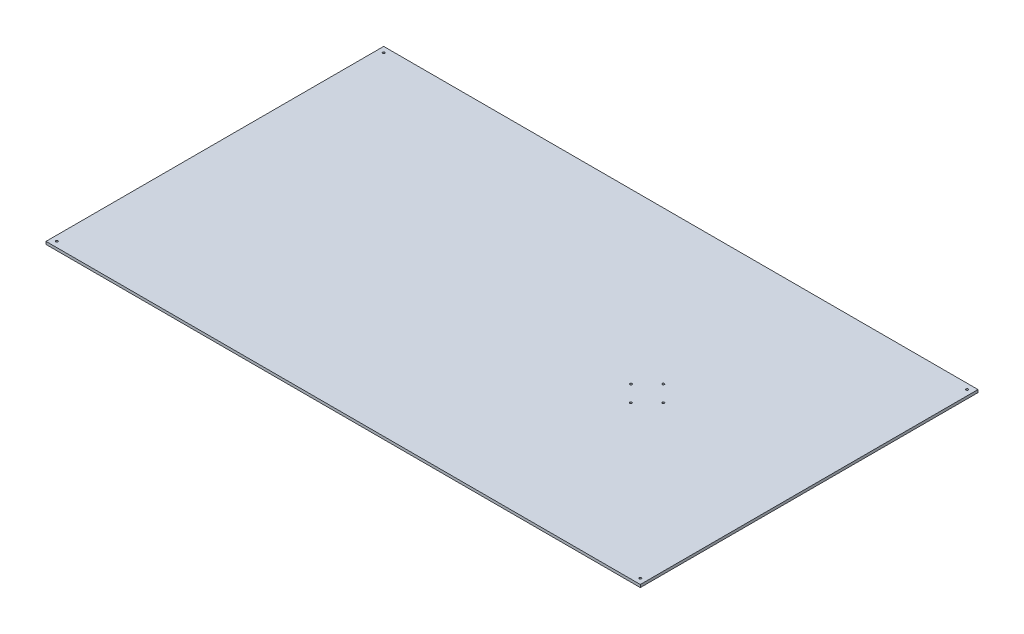
ISO-10303-21;
HEADER;
FILE_DESCRIPTION(('STEP AP214'),'2;1');
FILE_NAME('part.step','',(''),(''),'','','');
FILE_SCHEMA(('AUTOMOTIVE_DESIGN { 1 0 10303 214 1 1 1 1 }'));
ENDSEC;
DATA;
#1=APPLICATION_CONTEXT('core data for automotive mechanical design processes');
#2=APPLICATION_PROTOCOL_DEFINITION('international standard','automotive_design',2000,#1);
#3=PRODUCT_CONTEXT('',#1,'mechanical');
#4=PRODUCT('Part','Part','',(#3));
#5=PRODUCT_RELATED_PRODUCT_CATEGORY('part','',(#4));
#6=PRODUCT_DEFINITION_FORMATION('','',#4);
#7=PRODUCT_DEFINITION_CONTEXT('part definition',#1,'design');
#8=PRODUCT_DEFINITION('design','',#6,#7);
#9=PRODUCT_DEFINITION_SHAPE('','',#8);
#10=(LENGTH_UNIT() NAMED_UNIT(*) SI_UNIT(.MILLI.,.METRE.));
#11=(NAMED_UNIT(*) PLANE_ANGLE_UNIT() SI_UNIT($,.RADIAN.));
#12=(NAMED_UNIT(*) SI_UNIT($,.STERADIAN.) SOLID_ANGLE_UNIT());
#13=UNCERTAINTY_MEASURE_WITH_UNIT(LENGTH_MEASURE(1.E-05),#10,'distance_accuracy_value','');
#14=(GEOMETRIC_REPRESENTATION_CONTEXT(3) GLOBAL_UNCERTAINTY_ASSIGNED_CONTEXT((#13)) GLOBAL_UNIT_ASSIGNED_CONTEXT((#10,
#11,#12)) REPRESENTATION_CONTEXT('',''));
#15=CARTESIAN_POINT('',(0.,0.,0.));
#16=DIRECTION('',(0.,0.,1.));
#17=DIRECTION('',(1.,0.,0.));
#18=AXIS2_PLACEMENT_3D('',#15,#16,#17);
#19=CARTESIAN_POINT('',(-1100.,10.,-625.));
#20=DIRECTION('',(0.,0.,-1.));
#21=DIRECTION('',(-1.,0.,0.));
#22=AXIS2_PLACEMENT_3D('',#19,#20,#21);
#23=PLANE('',#22);
#24=DIRECTION('',(1.,0.,0.));
#25=VECTOR('',#24,1.);
#26=CARTESIAN_POINT('',(-1100.,0.,-625.));
#27=LINE('',#26,#25);
#28=CARTESIAN_POINT('',(-1100.,0.,-625.));
#29=VERTEX_POINT('',#28);
#30=CARTESIAN_POINT('',(1100.,0.,-625.));
#31=VERTEX_POINT('',#30);
#32=EDGE_CURVE('E103',#29,#31,#27,.T.);
#33=ORIENTED_EDGE('',*,*,#32,.F.);
#34=DIRECTION('',(0.,-1.,0.));
#35=VECTOR('',#34,1.);
#36=CARTESIAN_POINT('',(-1100.,10.,-625.));
#37=LINE('',#36,#35);
#38=CARTESIAN_POINT('',(-1100.,10.,-625.));
#39=VERTEX_POINT('',#38);
#40=EDGE_CURVE('E11',#39,#29,#37,.T.);
#41=ORIENTED_EDGE('',*,*,#40,.F.);
#42=DIRECTION('',(1.,0.,0.));
#43=VECTOR('',#42,1.);
#44=CARTESIAN_POINT('',(-1100.,10.,-625.));
#45=LINE('',#44,#43);
#46=CARTESIAN_POINT('',(1100.,10.,-625.));
#47=VERTEX_POINT('',#46);
#48=EDGE_CURVE('E97',#39,#47,#45,.T.);
#49=ORIENTED_EDGE('',*,*,#48,.T.);
#50=DIRECTION('',(0.,-1.,0.));
#51=VECTOR('',#50,1.);
#52=CARTESIAN_POINT('',(1100.,10.,-625.));
#53=LINE('',#52,#51);
#54=EDGE_CURVE('E76',#47,#31,#53,.T.);
#55=ORIENTED_EDGE('',*,*,#54,.T.);
#56=EDGE_LOOP('',(#33,#41,#49,#55));
#57=FACE_BOUND('',#56,.T.);
#58=ADVANCED_FACE('F35',(#57),#23,.T.);
#59=CARTESIAN_POINT('',(-1100.,10.,-625.));
#60=DIRECTION('',(1.,0.,0.));
#61=DIRECTION('',(0.,0.,-1.));
#62=AXIS2_PLACEMENT_3D('',#59,#60,#61);
#63=PLANE('',#62);
#64=DIRECTION('',(0.,0.,1.));
#65=VECTOR('',#64,1.);
#66=CARTESIAN_POINT('',(-1100.,0.,-625.));
#67=LINE('',#66,#65);
#68=CARTESIAN_POINT('',(-1100.,0.,625.));
#69=VERTEX_POINT('',#68);
#70=EDGE_CURVE('E68',#29,#69,#67,.T.);
#71=ORIENTED_EDGE('',*,*,#70,.T.);
#72=DIRECTION('',(0.,-1.,0.));
#73=VECTOR('',#72,1.);
#74=CARTESIAN_POINT('',(-1100.,10.,625.));
#75=LINE('',#74,#73);
#76=CARTESIAN_POINT('',(-1100.,10.,625.));
#77=VERTEX_POINT('',#76);
#78=EDGE_CURVE('E44',#77,#69,#75,.T.);
#79=ORIENTED_EDGE('',*,*,#78,.F.);
#80=DIRECTION('',(0.,0.,1.));
#81=VECTOR('',#80,1.);
#82=CARTESIAN_POINT('',(-1100.,10.,-625.));
#83=LINE('',#82,#81);
#84=EDGE_CURVE('E86',#39,#77,#83,.T.);
#85=ORIENTED_EDGE('',*,*,#84,.F.);
#86=ORIENTED_EDGE('',*,*,#40,.T.);
#87=EDGE_LOOP('',(#71,#79,#85,#86));
#88=FACE_BOUND('',#87,.T.);
#89=ADVANCED_FACE('F147',(#88),#63,.F.);
#90=CARTESIAN_POINT('',(-1100.,10.,625.));
#91=DIRECTION('',(0.,0.,-1.));
#92=DIRECTION('',(-1.,0.,0.));
#93=AXIS2_PLACEMENT_3D('',#90,#91,#92);
#94=PLANE('',#93);
#95=DIRECTION('',(1.,0.,0.));
#96=VECTOR('',#95,1.);
#97=CARTESIAN_POINT('',(-1100.,0.,625.));
#98=LINE('',#97,#96);
#99=CARTESIAN_POINT('',(1100.,0.,625.));
#100=VERTEX_POINT('',#99);
#101=EDGE_CURVE('E93',#69,#100,#98,.T.);
#102=ORIENTED_EDGE('',*,*,#101,.T.);
#103=DIRECTION('',(0.,-1.,0.));
#104=VECTOR('',#103,1.);
#105=CARTESIAN_POINT('',(1100.,10.,625.));
#106=LINE('',#105,#104);
#107=CARTESIAN_POINT('',(1100.,10.,625.));
#108=VERTEX_POINT('',#107);
#109=EDGE_CURVE('E90',#108,#100,#106,.T.);
#110=ORIENTED_EDGE('',*,*,#109,.F.);
#111=DIRECTION('',(1.,0.,0.));
#112=VECTOR('',#111,1.);
#113=CARTESIAN_POINT('',(-1100.,10.,625.));
#114=LINE('',#113,#112);
#115=EDGE_CURVE('E81',#77,#108,#114,.T.);
#116=ORIENTED_EDGE('',*,*,#115,.F.);
#117=ORIENTED_EDGE('',*,*,#78,.T.);
#118=EDGE_LOOP('',(#102,#110,#116,#117));
#119=FACE_BOUND('',#118,.T.);
#120=ADVANCED_FACE('F91',(#119),#94,.F.);
#121=CARTESIAN_POINT('',(1100.,10.,-625.));
#122=DIRECTION('',(1.,0.,0.));
#123=DIRECTION('',(0.,0.,-1.));
#124=AXIS2_PLACEMENT_3D('',#121,#122,#123);
#125=PLANE('',#124);
#126=DIRECTION('',(0.,0.,1.));
#127=VECTOR('',#126,1.);
#128=CARTESIAN_POINT('',(1100.,0.,-625.));
#129=LINE('',#128,#127);
#130=EDGE_CURVE('E106',#31,#100,#129,.T.);
#131=ORIENTED_EDGE('',*,*,#130,.F.);
#132=ORIENTED_EDGE('',*,*,#54,.F.);
#133=DIRECTION('',(0.,0.,1.));
#134=VECTOR('',#133,1.);
#135=CARTESIAN_POINT('',(1100.,10.,-625.));
#136=LINE('',#135,#134);
#137=EDGE_CURVE('E85',#47,#108,#136,.T.);
#138=ORIENTED_EDGE('',*,*,#137,.T.);
#139=ORIENTED_EDGE('',*,*,#109,.T.);
#140=EDGE_LOOP('',(#131,#132,#138,#139));
#141=FACE_BOUND('',#140,.T.);
#142=ADVANCED_FACE('F96',(#141),#125,.T.);
#143=CARTESIAN_POINT('',(0.,10.,0.));
#144=DIRECTION('',(0.,-1.,0.));
#145=DIRECTION('',(0.,0.,-1.));
#146=AXIS2_PLACEMENT_3D('',#143,#144,#145);
#147=PLANE('',#146);
#148=CARTESIAN_POINT('',(500.,10.,-60.0000000000001));
#149=DIRECTION('',(0.,1.,0.));
#150=DIRECTION('',(0.,0.,1.));
#151=AXIS2_PLACEMENT_3D('',#148,#149,#150);
#152=CIRCLE('',#151,4.);
#153=CARTESIAN_POINT('',(500.,10.,-56.0000000000001));
#154=VERTEX_POINT('',#153);
#155=EDGE_CURVE('E202',#154,#154,#152,.T.);
#156=ORIENTED_EDGE('',*,*,#155,.F.);
#157=EDGE_LOOP('',(#156));
#158=FACE_BOUND('',#157,.T.);
#159=CARTESIAN_POINT('',(440.,10.,0.));
#160=DIRECTION('',(0.,1.,0.));
#161=DIRECTION('',(0.,0.,1.));
#162=AXIS2_PLACEMENT_3D('',#159,#160,#161);
#163=CIRCLE('',#162,4.);
#164=CARTESIAN_POINT('',(440.,10.,4.));
#165=VERTEX_POINT('',#164);
#166=EDGE_CURVE('E204',#165,#165,#163,.T.);
#167=ORIENTED_EDGE('',*,*,#166,.F.);
#168=EDGE_LOOP('',(#167));
#169=FACE_BOUND('',#168,.T.);
#170=CARTESIAN_POINT('',(500.,10.,60.0000000000001));
#171=DIRECTION('',(0.,1.,0.));
#172=DIRECTION('',(0.,0.,1.));
#173=AXIS2_PLACEMENT_3D('',#170,#171,#172);
#174=CIRCLE('',#173,4.);
#175=CARTESIAN_POINT('',(500.,10.,64.0000000000001));
#176=VERTEX_POINT('',#175);
#177=EDGE_CURVE('E209',#176,#176,#174,.T.);
#178=ORIENTED_EDGE('',*,*,#177,.F.);
#179=EDGE_LOOP('',(#178));
#180=FACE_BOUND('',#179,.T.);
#181=CARTESIAN_POINT('',(560.,10.,0.));
#182=DIRECTION('',(0.,1.,0.));
#183=DIRECTION('',(0.,0.,1.));
#184=AXIS2_PLACEMENT_3D('',#181,#182,#183);
#185=CIRCLE('',#184,4.);
#186=CARTESIAN_POINT('',(560.,10.,4.));
#187=VERTEX_POINT('',#186);
#188=EDGE_CURVE('E215',#187,#187,#185,.T.);
#189=ORIENTED_EDGE('',*,*,#188,.F.);
#190=EDGE_LOOP('',(#189));
#191=FACE_BOUND('',#190,.T.);
#192=CARTESIAN_POINT('',(-1080.,10.,-605.));
#193=DIRECTION('',(0.,1.,0.));
#194=DIRECTION('',(0.,0.,1.));
#195=AXIS2_PLACEMENT_3D('',#192,#193,#194);
#196=CIRCLE('',#195,4.);
#197=CARTESIAN_POINT('',(-1080.,10.,-601.));
#198=VERTEX_POINT('',#197);
#199=EDGE_CURVE('E127',#198,#198,#196,.T.);
#200=ORIENTED_EDGE('',*,*,#199,.F.);
#201=EDGE_LOOP('',(#200));
#202=FACE_BOUND('',#201,.T.);
#203=CARTESIAN_POINT('',(1080.,10.,-605.));
#204=DIRECTION('',(0.,1.,0.));
#205=DIRECTION('',(0.,0.,1.));
#206=AXIS2_PLACEMENT_3D('',#203,#204,#205);
#207=CIRCLE('',#206,4.);
#208=CARTESIAN_POINT('',(1080.,10.,-601.));
#209=VERTEX_POINT('',#208);
#210=EDGE_CURVE('E115',#209,#209,#207,.T.);
#211=ORIENTED_EDGE('',*,*,#210,.F.);
#212=EDGE_LOOP('',(#211));
#213=FACE_BOUND('',#212,.T.);
#214=CARTESIAN_POINT('',(1080.,10.,605.));
#215=DIRECTION('',(0.,1.,0.));
#216=DIRECTION('',(0.,0.,1.));
#217=AXIS2_PLACEMENT_3D('',#214,#215,#216);
#218=CIRCLE('',#217,4.);
#219=CARTESIAN_POINT('',(1080.,10.,609.));
#220=VERTEX_POINT('',#219);
#221=EDGE_CURVE('E114',#220,#220,#218,.T.);
#222=ORIENTED_EDGE('',*,*,#221,.F.);
#223=EDGE_LOOP('',(#222));
#224=FACE_BOUND('',#223,.T.);
#225=CARTESIAN_POINT('',(-1080.,10.,605.));
#226=DIRECTION('',(0.,1.,0.));
#227=DIRECTION('',(0.,0.,1.));
#228=AXIS2_PLACEMENT_3D('',#225,#226,#227);
#229=CIRCLE('',#228,4.);
#230=CARTESIAN_POINT('',(-1080.,10.,609.));
#231=VERTEX_POINT('',#230);
#232=EDGE_CURVE('E133',#231,#231,#229,.T.);
#233=ORIENTED_EDGE('',*,*,#232,.F.);
#234=EDGE_LOOP('',(#233));
#235=FACE_BOUND('',#234,.T.);
#236=ORIENTED_EDGE('',*,*,#48,.F.);
#237=ORIENTED_EDGE('',*,*,#84,.T.);
#238=ORIENTED_EDGE('',*,*,#115,.T.);
#239=ORIENTED_EDGE('',*,*,#137,.F.);
#240=EDGE_LOOP('',(#236,#237,#238,#239));
#241=FACE_BOUND('',#240,.T.);
#242=ADVANCED_FACE('F84',(#158,#169,#180,#191,#202,#213,#224,#235,#241),#147,.F.);
#243=CARTESIAN_POINT('',(0.,0.,0.));
#244=DIRECTION('',(0.,-1.,0.));
#245=DIRECTION('',(0.,0.,-1.));
#246=AXIS2_PLACEMENT_3D('',#243,#244,#245);
#247=PLANE('',#246);
#248=CARTESIAN_POINT('',(500.,0.,-60.0000000000001));
#249=DIRECTION('',(0.,-1.,0.));
#250=DIRECTION('',(0.,0.,-1.));
#251=AXIS2_PLACEMENT_3D('',#248,#249,#250);
#252=CIRCLE('',#251,4.);
#253=CARTESIAN_POINT('',(500.,0.,-64.0000000000001));
#254=VERTEX_POINT('',#253);
#255=EDGE_CURVE('E200',#254,#254,#252,.T.);
#256=ORIENTED_EDGE('',*,*,#255,.F.);
#257=EDGE_LOOP('',(#256));
#258=FACE_BOUND('',#257,.T.);
#259=CARTESIAN_POINT('',(440.,0.,0.));
#260=DIRECTION('',(0.,-1.,0.));
#261=DIRECTION('',(0.,0.,-1.));
#262=AXIS2_PLACEMENT_3D('',#259,#260,#261);
#263=CIRCLE('',#262,4.);
#264=CARTESIAN_POINT('',(440.,0.,-4.));
#265=VERTEX_POINT('',#264);
#266=EDGE_CURVE('E38',#265,#265,#263,.T.);
#267=ORIENTED_EDGE('',*,*,#266,.F.);
#268=EDGE_LOOP('',(#267));
#269=FACE_BOUND('',#268,.T.);
#270=CARTESIAN_POINT('',(500.,0.,60.0000000000001));
#271=DIRECTION('',(0.,-1.,0.));
#272=DIRECTION('',(0.,0.,-1.));
#273=AXIS2_PLACEMENT_3D('',#270,#271,#272);
#274=CIRCLE('',#273,4.);
#275=CARTESIAN_POINT('',(500.,0.,56.0000000000001));
#276=VERTEX_POINT('',#275);
#277=EDGE_CURVE('E212',#276,#276,#274,.T.);
#278=ORIENTED_EDGE('',*,*,#277,.F.);
#279=EDGE_LOOP('',(#278));
#280=FACE_BOUND('',#279,.T.);
#281=CARTESIAN_POINT('',(560.,0.,0.));
#282=DIRECTION('',(0.,-1.,0.));
#283=DIRECTION('',(0.,0.,-1.));
#284=AXIS2_PLACEMENT_3D('',#281,#282,#283);
#285=CIRCLE('',#284,4.);
#286=CARTESIAN_POINT('',(560.,0.,-4.));
#287=VERTEX_POINT('',#286);
#288=EDGE_CURVE('E218',#287,#287,#285,.T.);
#289=ORIENTED_EDGE('',*,*,#288,.F.);
#290=EDGE_LOOP('',(#289));
#291=FACE_BOUND('',#290,.T.);
#292=CARTESIAN_POINT('',(-1080.,0.,-605.));
#293=DIRECTION('',(0.,-1.,0.));
#294=DIRECTION('',(0.,0.,-1.));
#295=AXIS2_PLACEMENT_3D('',#292,#293,#294);
#296=CIRCLE('',#295,4.);
#297=CARTESIAN_POINT('',(-1080.,0.,-609.));
#298=VERTEX_POINT('',#297);
#299=EDGE_CURVE('E122',#298,#298,#296,.T.);
#300=ORIENTED_EDGE('',*,*,#299,.F.);
#301=EDGE_LOOP('',(#300));
#302=FACE_BOUND('',#301,.T.);
#303=CARTESIAN_POINT('',(1080.,0.,-605.));
#304=DIRECTION('',(0.,-1.,0.));
#305=DIRECTION('',(0.,0.,-1.));
#306=AXIS2_PLACEMENT_3D('',#303,#304,#305);
#307=CIRCLE('',#306,4.);
#308=CARTESIAN_POINT('',(1080.,0.,-609.));
#309=VERTEX_POINT('',#308);
#310=EDGE_CURVE('E112',#309,#309,#307,.T.);
#311=ORIENTED_EDGE('',*,*,#310,.F.);
#312=EDGE_LOOP('',(#311));
#313=FACE_BOUND('',#312,.T.);
#314=CARTESIAN_POINT('',(1080.,0.,605.));
#315=DIRECTION('',(0.,-1.,0.));
#316=DIRECTION('',(0.,0.,-1.));
#317=AXIS2_PLACEMENT_3D('',#314,#315,#316);
#318=CIRCLE('',#317,4.);
#319=CARTESIAN_POINT('',(1080.,0.,601.));
#320=VERTEX_POINT('',#319);
#321=EDGE_CURVE('E119',#320,#320,#318,.T.);
#322=ORIENTED_EDGE('',*,*,#321,.F.);
#323=EDGE_LOOP('',(#322));
#324=FACE_BOUND('',#323,.T.);
#325=CARTESIAN_POINT('',(-1080.,0.,605.));
#326=DIRECTION('',(0.,-1.,0.));
#327=DIRECTION('',(0.,0.,-1.));
#328=AXIS2_PLACEMENT_3D('',#325,#326,#327);
#329=CIRCLE('',#328,4.);
#330=CARTESIAN_POINT('',(-1080.,0.,601.));
#331=VERTEX_POINT('',#330);
#332=EDGE_CURVE('E107',#331,#331,#329,.T.);
#333=ORIENTED_EDGE('',*,*,#332,.F.);
#334=EDGE_LOOP('',(#333));
#335=FACE_BOUND('',#334,.T.);
#336=ORIENTED_EDGE('',*,*,#32,.T.);
#337=ORIENTED_EDGE('',*,*,#130,.T.);
#338=ORIENTED_EDGE('',*,*,#101,.F.);
#339=ORIENTED_EDGE('',*,*,#70,.F.);
#340=EDGE_LOOP('',(#336,#337,#338,#339));
#341=FACE_BOUND('',#340,.T.);
#342=ADVANCED_FACE('F141',(#258,#269,#280,#291,#302,#313,#324,#335,#341),#247,.T.);
#343=CARTESIAN_POINT('',(-1080.,10.,605.));
#344=DIRECTION('',(0.,1.,0.));
#345=DIRECTION('',(0.,0.,1.));
#346=AXIS2_PLACEMENT_3D('',#343,#344,#345);
#347=CYLINDRICAL_SURFACE('',#346,4.);
#348=ORIENTED_EDGE('',*,*,#332,.T.);
#349=EDGE_LOOP('',(#348));
#350=FACE_BOUND('',#349,.T.);
#351=ORIENTED_EDGE('',*,*,#232,.T.);
#352=EDGE_LOOP('',(#351));
#353=FACE_BOUND('',#352,.T.);
#354=ADVANCED_FACE('F138',(#350,#353),#347,.F.);
#355=CARTESIAN_POINT('',(1080.,10.,605.));
#356=DIRECTION('',(0.,1.,0.));
#357=DIRECTION('',(0.,0.,1.));
#358=AXIS2_PLACEMENT_3D('',#355,#356,#357);
#359=CYLINDRICAL_SURFACE('',#358,4.);
#360=ORIENTED_EDGE('',*,*,#321,.T.);
#361=EDGE_LOOP('',(#360));
#362=FACE_BOUND('',#361,.T.);
#363=ORIENTED_EDGE('',*,*,#221,.T.);
#364=EDGE_LOOP('',(#363));
#365=FACE_BOUND('',#364,.T.);
#366=ADVANCED_FACE('F169',(#362,#365),#359,.F.);
#367=CARTESIAN_POINT('',(1080.,10.,-605.));
#368=DIRECTION('',(0.,1.,0.));
#369=DIRECTION('',(0.,0.,1.));
#370=AXIS2_PLACEMENT_3D('',#367,#368,#369);
#371=CYLINDRICAL_SURFACE('',#370,4.);
#372=ORIENTED_EDGE('',*,*,#310,.T.);
#373=EDGE_LOOP('',(#372));
#374=FACE_BOUND('',#373,.T.);
#375=ORIENTED_EDGE('',*,*,#210,.T.);
#376=EDGE_LOOP('',(#375));
#377=FACE_BOUND('',#376,.T.);
#378=ADVANCED_FACE('F172',(#374,#377),#371,.F.);
#379=CARTESIAN_POINT('',(-1080.,10.,-605.));
#380=DIRECTION('',(0.,1.,0.));
#381=DIRECTION('',(0.,0.,1.));
#382=AXIS2_PLACEMENT_3D('',#379,#380,#381);
#383=CYLINDRICAL_SURFACE('',#382,4.);
#384=ORIENTED_EDGE('',*,*,#299,.T.);
#385=EDGE_LOOP('',(#384));
#386=FACE_BOUND('',#385,.T.);
#387=ORIENTED_EDGE('',*,*,#199,.T.);
#388=EDGE_LOOP('',(#387));
#389=FACE_BOUND('',#388,.T.);
#390=ADVANCED_FACE('F176',(#386,#389),#383,.F.);
#391=CARTESIAN_POINT('',(560.,10.,0.));
#392=DIRECTION('',(0.,1.,0.));
#393=DIRECTION('',(0.,0.,1.));
#394=AXIS2_PLACEMENT_3D('',#391,#392,#393);
#395=CYLINDRICAL_SURFACE('',#394,4.);
#396=ORIENTED_EDGE('',*,*,#288,.T.);
#397=EDGE_LOOP('',(#396));
#398=FACE_BOUND('',#397,.T.);
#399=ORIENTED_EDGE('',*,*,#188,.T.);
#400=EDGE_LOOP('',(#399));
#401=FACE_BOUND('',#400,.T.);
#402=ADVANCED_FACE('F179',(#398,#401),#395,.F.);
#403=CARTESIAN_POINT('',(500.,10.,60.0000000000001));
#404=DIRECTION('',(0.,1.,0.));
#405=DIRECTION('',(0.,0.,1.));
#406=AXIS2_PLACEMENT_3D('',#403,#404,#405);
#407=CYLINDRICAL_SURFACE('',#406,4.);
#408=ORIENTED_EDGE('',*,*,#277,.T.);
#409=EDGE_LOOP('',(#408));
#410=FACE_BOUND('',#409,.T.);
#411=ORIENTED_EDGE('',*,*,#177,.T.);
#412=EDGE_LOOP('',(#411));
#413=FACE_BOUND('',#412,.T.);
#414=ADVANCED_FACE('F183',(#410,#413),#407,.F.);
#415=CARTESIAN_POINT('',(440.,10.,0.));
#416=DIRECTION('',(0.,1.,0.));
#417=DIRECTION('',(0.,0.,1.));
#418=AXIS2_PLACEMENT_3D('',#415,#416,#417);
#419=CYLINDRICAL_SURFACE('',#418,4.);
#420=ORIENTED_EDGE('',*,*,#266,.T.);
#421=EDGE_LOOP('',(#420));
#422=FACE_BOUND('',#421,.T.);
#423=ORIENTED_EDGE('',*,*,#166,.T.);
#424=EDGE_LOOP('',(#423));
#425=FACE_BOUND('',#424,.T.);
#426=ADVANCED_FACE('F187',(#422,#425),#419,.F.);
#427=CARTESIAN_POINT('',(500.,10.,-60.0000000000001));
#428=DIRECTION('',(0.,1.,0.));
#429=DIRECTION('',(0.,0.,1.));
#430=AXIS2_PLACEMENT_3D('',#427,#428,#429);
#431=CYLINDRICAL_SURFACE('',#430,4.);
#432=ORIENTED_EDGE('',*,*,#255,.T.);
#433=EDGE_LOOP('',(#432));
#434=FACE_BOUND('',#433,.T.);
#435=ORIENTED_EDGE('',*,*,#155,.T.);
#436=EDGE_LOOP('',(#435));
#437=FACE_BOUND('',#436,.T.);
#438=ADVANCED_FACE('F191',(#434,#437),#431,.F.);
#439=CLOSED_SHELL('',(#58,#89,#120,#142,#242,#342,#354,#366,#378,#390,#402,#414,#426,#438));
#440=MANIFOLD_SOLID_BREP('B2',#439);
#441=ADVANCED_BREP_SHAPE_REPRESENTATION('',(#18,#440),#14);
#442=SHAPE_DEFINITION_REPRESENTATION(#9,#441);
ENDSEC;
END-ISO-10303-21;
